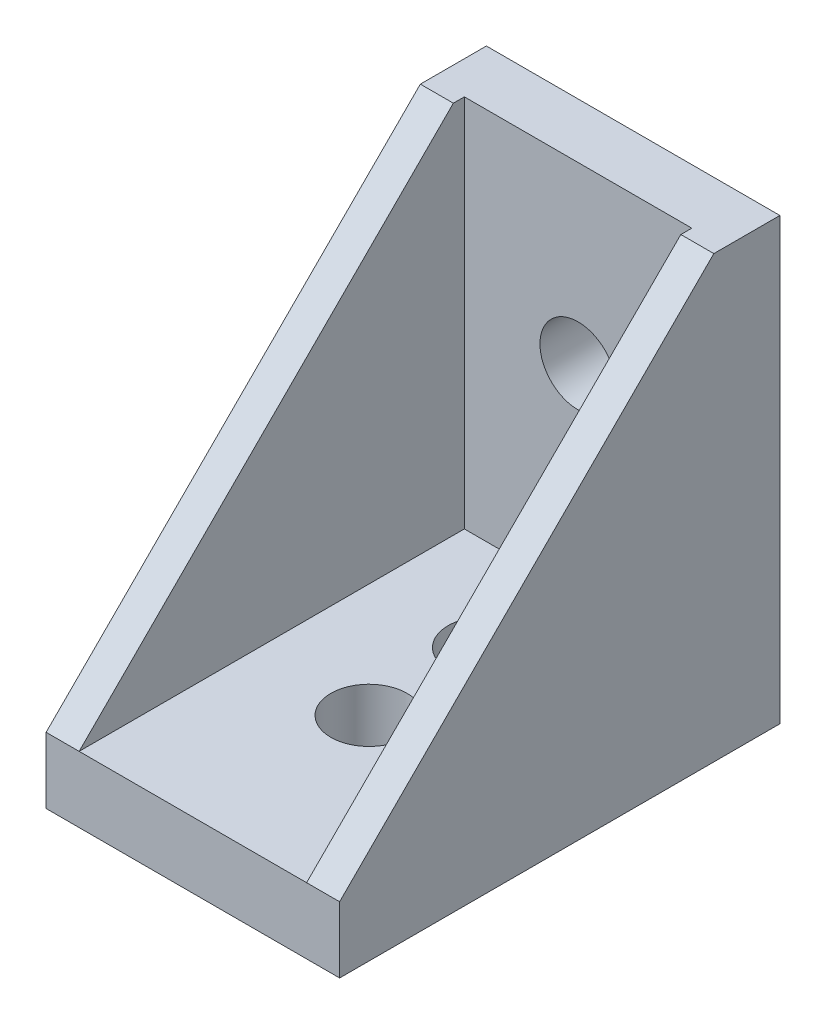
ISO-10303-21;
HEADER;
FILE_DESCRIPTION(('STEP AP214'),'2;1');
FILE_NAME('part.step','',(''),(''),'','','');
FILE_SCHEMA(('AUTOMOTIVE_DESIGN { 1 0 10303 214 1 1 1 1 }'));
ENDSEC;
DATA;
#1=APPLICATION_CONTEXT('core data for automotive mechanical design processes');
#2=APPLICATION_PROTOCOL_DEFINITION('international standard','automotive_design',2000,#1);
#3=PRODUCT_CONTEXT('',#1,'mechanical');
#4=PRODUCT('Part','Part','',(#3));
#5=PRODUCT_RELATED_PRODUCT_CATEGORY('part','',(#4));
#6=PRODUCT_DEFINITION_FORMATION('','',#4);
#7=PRODUCT_DEFINITION_CONTEXT('part definition',#1,'design');
#8=PRODUCT_DEFINITION('design','',#6,#7);
#9=PRODUCT_DEFINITION_SHAPE('','',#8);
#10=(LENGTH_UNIT() NAMED_UNIT(*) SI_UNIT(.MILLI.,.METRE.));
#11=(NAMED_UNIT(*) PLANE_ANGLE_UNIT() SI_UNIT($,.RADIAN.));
#12=(NAMED_UNIT(*) SI_UNIT($,.STERADIAN.) SOLID_ANGLE_UNIT());
#13=UNCERTAINTY_MEASURE_WITH_UNIT(LENGTH_MEASURE(1.E-05),#10,'distance_accuracy_value','');
#14=(GEOMETRIC_REPRESENTATION_CONTEXT(3) GLOBAL_UNCERTAINTY_ASSIGNED_CONTEXT((#13)) GLOBAL_UNIT_ASSIGNED_CONTEXT((#10,
#11,#12)) REPRESENTATION_CONTEXT('',''));
#15=CARTESIAN_POINT('',(0.,0.,0.));
#16=DIRECTION('',(0.,0.,1.));
#17=DIRECTION('',(1.,0.,0.));
#18=AXIS2_PLACEMENT_3D('',#15,#16,#17);
#19=CARTESIAN_POINT('',(7.75,0.,0.));
#20=DIRECTION('',(1.,0.,0.));
#21=DIRECTION('',(0.,0.,-1.));
#22=AXIS2_PLACEMENT_3D('',#19,#20,#21);
#23=PLANE('',#22);
#24=DIRECTION('',(0.,0.,-1.));
#25=VECTOR('',#24,1.);
#26=CARTESIAN_POINT('',(7.75,4.5,11.25));
#27=LINE('',#26,#25);
#28=CARTESIAN_POINT('',(7.75,4.5,-11.25));
#29=VERTEX_POINT('',#28);
#30=CARTESIAN_POINT('',(7.75,4.5,15.));
#31=VERTEX_POINT('',#30);
#32=EDGE_CURVE('E105',#29,#31,#27,.F.);
#33=ORIENTED_EDGE('',*,*,#32,.T.);
#34=DIRECTION('',(0.,0.707106781186548,-0.707106781186547));
#35=VECTOR('',#34,1.);
#36=CARTESIAN_POINT('',(7.75,4.5,15.));
#37=LINE('',#36,#35);
#38=CARTESIAN_POINT('',(7.75,30.,-10.5));
#39=VERTEX_POINT('',#38);
#40=EDGE_CURVE('E137',#31,#39,#37,.T.);
#41=ORIENTED_EDGE('',*,*,#40,.T.);
#42=DIRECTION('',(0.,0.,-1.));
#43=VECTOR('',#42,1.);
#44=CARTESIAN_POINT('',(7.75,30.,0.));
#45=LINE('',#44,#43);
#46=CARTESIAN_POINT('',(7.75,30.,-11.25));
#47=VERTEX_POINT('',#46);
#48=EDGE_CURVE('E152',#47,#39,#45,.F.);
#49=ORIENTED_EDGE('',*,*,#48,.F.);
#50=DIRECTION('',(0.,1.,0.));
#51=VECTOR('',#50,1.);
#52=CARTESIAN_POINT('',(7.75,4.5,-11.25));
#53=LINE('',#52,#51);
#54=EDGE_CURVE('E132',#47,#29,#53,.F.);
#55=ORIENTED_EDGE('',*,*,#54,.T.);
#56=EDGE_LOOP('',(#33,#41,#49,#55));
#57=FACE_BOUND('',#56,.T.);
#58=ADVANCED_FACE('F17',(#57),#23,.F.);
#59=CARTESIAN_POINT('',(-7.75,0.,0.));
#60=DIRECTION('',(1.,0.,0.));
#61=DIRECTION('',(0.,0.,-1.));
#62=AXIS2_PLACEMENT_3D('',#59,#60,#61);
#63=PLANE('',#62);
#64=DIRECTION('',(0.,0.707106781186548,-0.707106781186547));
#65=VECTOR('',#64,1.);
#66=CARTESIAN_POINT('',(-7.75,4.5,15.));
#67=LINE('',#66,#65);
#68=CARTESIAN_POINT('',(-7.75,30.,-10.5));
#69=VERTEX_POINT('',#68);
#70=CARTESIAN_POINT('',(-7.75,4.5,15.));
#71=VERTEX_POINT('',#70);
#72=EDGE_CURVE('E118',#69,#71,#67,.F.);
#73=ORIENTED_EDGE('',*,*,#72,.T.);
#74=DIRECTION('',(0.,0.,-1.));
#75=VECTOR('',#74,1.);
#76=CARTESIAN_POINT('',(-7.75,4.5,11.25));
#77=LINE('',#76,#75);
#78=CARTESIAN_POINT('',(-7.75,4.5,-11.25));
#79=VERTEX_POINT('',#78);
#80=EDGE_CURVE('E112',#71,#79,#77,.T.);
#81=ORIENTED_EDGE('',*,*,#80,.T.);
#82=DIRECTION('',(0.,1.,0.));
#83=VECTOR('',#82,1.);
#84=CARTESIAN_POINT('',(-7.75,4.5,-11.25));
#85=LINE('',#84,#83);
#86=CARTESIAN_POINT('',(-7.75,30.,-11.25));
#87=VERTEX_POINT('',#86);
#88=EDGE_CURVE('E115',#79,#87,#85,.T.);
#89=ORIENTED_EDGE('',*,*,#88,.T.);
#90=DIRECTION('',(0.,0.,-1.));
#91=VECTOR('',#90,1.);
#92=CARTESIAN_POINT('',(-7.75,30.,0.));
#93=LINE('',#92,#91);
#94=EDGE_CURVE('E121',#87,#69,#93,.F.);
#95=ORIENTED_EDGE('',*,*,#94,.T.);
#96=EDGE_LOOP('',(#73,#81,#89,#95));
#97=FACE_BOUND('',#96,.T.);
#98=ADVANCED_FACE('F114',(#97),#63,.T.);
#99=CARTESIAN_POINT('',(-7.75,4.5,11.25));
#100=DIRECTION('',(0.,-1.,0.));
#101=DIRECTION('',(0.,0.,-1.));
#102=AXIS2_PLACEMENT_3D('',#99,#100,#101);
#103=PLANE('',#102);
#104=DIRECTION('',(-1.,0.,0.));
#105=VECTOR('',#104,1.);
#106=CARTESIAN_POINT('',(-7.75,4.5,-11.25));
#107=LINE('',#106,#105);
#108=EDGE_CURVE('E127',#29,#79,#107,.T.);
#109=ORIENTED_EDGE('',*,*,#108,.T.);
#110=ORIENTED_EDGE('',*,*,#80,.F.);
#111=DIRECTION('',(1.,0.,0.));
#112=VECTOR('',#111,1.);
#113=CARTESIAN_POINT('',(10.,4.5,15.));
#114=LINE('',#113,#112);
#115=EDGE_CURVE('E247',#71,#31,#114,.T.);
#116=ORIENTED_EDGE('',*,*,#115,.T.);
#117=ORIENTED_EDGE('',*,*,#32,.F.);
#118=EDGE_LOOP('',(#109,#110,#116,#117));
#119=FACE_BOUND('',#118,.T.);
#120=CARTESIAN_POINT('',(0.,4.5,-5.));
#121=DIRECTION('',(0.,1.,0.));
#122=DIRECTION('',(0.,0.,1.));
#123=AXIS2_PLACEMENT_3D('',#120,#121,#122);
#124=CIRCLE('',#123,2.6);
#125=CARTESIAN_POINT('',(0.,4.5,-2.4));
#126=VERTEX_POINT('',#125);
#127=EDGE_CURVE('E144',#126,#126,#124,.F.);
#128=ORIENTED_EDGE('',*,*,#127,.T.);
#129=EDGE_LOOP('',(#128));
#130=FACE_BOUND('',#129,.T.);
#131=CARTESIAN_POINT('',(0.,4.5,3.00000000000001));
#132=DIRECTION('',(0.,1.,0.));
#133=DIRECTION('',(0.,0.,1.));
#134=AXIS2_PLACEMENT_3D('',#131,#132,#133);
#135=CIRCLE('',#134,2.6);
#136=CARTESIAN_POINT('',(0.,4.5,5.60000000000001));
#137=VERTEX_POINT('',#136);
#138=EDGE_CURVE('E20',#137,#137,#135,.F.);
#139=ORIENTED_EDGE('',*,*,#138,.T.);
#140=EDGE_LOOP('',(#139));
#141=FACE_BOUND('',#140,.T.);
#142=ADVANCED_FACE('F134',(#119,#130,#141),#103,.F.);
#143=CARTESIAN_POINT('',(0.,-11.,3.00000000000001));
#144=DIRECTION('',(0.,1.,0.));
#145=DIRECTION('',(0.,0.,1.));
#146=AXIS2_PLACEMENT_3D('',#143,#144,#145);
#147=CYLINDRICAL_SURFACE('',#146,2.6);
#148=CARTESIAN_POINT('',(0.,0.,3.00000000000001));
#149=DIRECTION('',(0.,1.,0.));
#150=DIRECTION('',(0.,0.,1.));
#151=AXIS2_PLACEMENT_3D('',#148,#149,#150);
#152=CIRCLE('',#151,2.6);
#153=CARTESIAN_POINT('',(0.,0.,5.60000000000001));
#154=VERTEX_POINT('',#153);
#155=EDGE_CURVE('E166',#154,#154,#152,.F.);
#156=ORIENTED_EDGE('',*,*,#155,.T.);
#157=EDGE_LOOP('',(#156));
#158=FACE_BOUND('',#157,.T.);
#159=ORIENTED_EDGE('',*,*,#138,.F.);
#160=EDGE_LOOP('',(#159));
#161=FACE_BOUND('',#160,.T.);
#162=ADVANCED_FACE('F183',(#158,#161),#147,.F.);
#163=CARTESIAN_POINT('',(0.,-11.,-5.));
#164=DIRECTION('',(0.,1.,0.));
#165=DIRECTION('',(0.,0.,1.));
#166=AXIS2_PLACEMENT_3D('',#163,#164,#165);
#167=CYLINDRICAL_SURFACE('',#166,2.6);
#168=CARTESIAN_POINT('',(0.,0.,-5.));
#169=DIRECTION('',(0.,1.,0.));
#170=DIRECTION('',(0.,0.,1.));
#171=AXIS2_PLACEMENT_3D('',#168,#169,#170);
#172=CIRCLE('',#171,2.6);
#173=CARTESIAN_POINT('',(0.,0.,-2.4));
#174=VERTEX_POINT('',#173);
#175=EDGE_CURVE('E161',#174,#174,#172,.F.);
#176=ORIENTED_EDGE('',*,*,#175,.T.);
#177=EDGE_LOOP('',(#176));
#178=FACE_BOUND('',#177,.T.);
#179=ORIENTED_EDGE('',*,*,#127,.F.);
#180=EDGE_LOOP('',(#179));
#181=FACE_BOUND('',#180,.T.);
#182=ADVANCED_FACE('F185',(#178,#181),#167,.F.);
#183=CARTESIAN_POINT('',(10.,4.5,15.));
#184=DIRECTION('',(0.,-0.707106781186547,-0.707106781186548));
#185=DIRECTION('',(0.,0.707106781186548,-0.707106781186547));
#186=AXIS2_PLACEMENT_3D('',#183,#184,#185);
#187=PLANE('',#186);
#188=ORIENTED_EDGE('',*,*,#40,.F.);
#189=DIRECTION('',(1.,0.,0.));
#190=VECTOR('',#189,1.);
#191=CARTESIAN_POINT('',(10.,4.5,15.));
#192=LINE('',#191,#190);
#193=CARTESIAN_POINT('',(10.,4.5,15.));
#194=VERTEX_POINT('',#193);
#195=EDGE_CURVE('E173',#31,#194,#192,.T.);
#196=ORIENTED_EDGE('',*,*,#195,.T.);
#197=DIRECTION('',(0.,-0.707106781186548,0.707106781186547));
#198=VECTOR('',#197,1.);
#199=CARTESIAN_POINT('',(10.,30.,-10.5));
#200=LINE('',#199,#198);
#201=CARTESIAN_POINT('',(10.,30.,-10.5));
#202=VERTEX_POINT('',#201);
#203=EDGE_CURVE('E266',#202,#194,#200,.T.);
#204=ORIENTED_EDGE('',*,*,#203,.F.);
#205=DIRECTION('',(1.,0.,0.));
#206=VECTOR('',#205,1.);
#207=CARTESIAN_POINT('',(10.,30.,-10.5));
#208=LINE('',#207,#206);
#209=EDGE_CURVE('E244',#202,#39,#208,.F.);
#210=ORIENTED_EDGE('',*,*,#209,.T.);
#211=EDGE_LOOP('',(#188,#196,#204,#210));
#212=FACE_BOUND('',#211,.T.);
#213=ADVANCED_FACE('F193',(#212),#187,.F.);
#214=CARTESIAN_POINT('',(-7.75,4.5,-11.25));
#215=DIRECTION('',(0.,0.,-1.));
#216=DIRECTION('',(-1.,0.,0.));
#217=AXIS2_PLACEMENT_3D('',#214,#215,#216);
#218=PLANE('',#217);
#219=DIRECTION('',(1.,0.,0.));
#220=VECTOR('',#219,1.);
#221=CARTESIAN_POINT('',(10.,30.,-11.25));
#222=LINE('',#221,#220);
#223=EDGE_CURVE('E130',#47,#87,#222,.F.);
#224=ORIENTED_EDGE('',*,*,#223,.T.);
#225=ORIENTED_EDGE('',*,*,#88,.F.);
#226=ORIENTED_EDGE('',*,*,#108,.F.);
#227=ORIENTED_EDGE('',*,*,#54,.F.);
#228=EDGE_LOOP('',(#224,#225,#226,#227));
#229=FACE_BOUND('',#228,.T.);
#230=CARTESIAN_POINT('',(0.,18.,-11.25));
#231=DIRECTION('',(0.,0.,1.));
#232=DIRECTION('',(1.,0.,0.));
#233=AXIS2_PLACEMENT_3D('',#230,#231,#232);
#234=CIRCLE('',#233,2.6);
#235=CARTESIAN_POINT('',(2.60000000000001,18.,-11.25));
#236=VERTEX_POINT('',#235);
#237=EDGE_CURVE('E170',#236,#236,#234,.F.);
#238=ORIENTED_EDGE('',*,*,#237,.T.);
#239=EDGE_LOOP('',(#238));
#240=FACE_BOUND('',#239,.T.);
#241=ADVANCED_FACE('F124',(#229,#240),#218,.F.);
#242=CARTESIAN_POINT('',(10.,4.5,15.));
#243=DIRECTION('',(0.,-0.707106781186547,-0.707106781186548));
#244=DIRECTION('',(0.,0.707106781186548,-0.707106781186547));
#245=AXIS2_PLACEMENT_3D('',#242,#243,#244);
#246=PLANE('',#245);
#247=DIRECTION('',(1.,0.,0.));
#248=VECTOR('',#247,1.);
#249=CARTESIAN_POINT('',(10.,30.,-10.5));
#250=LINE('',#249,#248);
#251=CARTESIAN_POINT('',(-10.,30.,-10.5));
#252=VERTEX_POINT('',#251);
#253=EDGE_CURVE('E278',#69,#252,#250,.F.);
#254=ORIENTED_EDGE('',*,*,#253,.T.);
#255=DIRECTION('',(0.,-0.707106781186548,0.707106781186547));
#256=VECTOR('',#255,1.);
#257=CARTESIAN_POINT('',(-10.,30.,-10.5));
#258=LINE('',#257,#256);
#259=CARTESIAN_POINT('',(-10.,4.5,15.));
#260=VERTEX_POINT('',#259);
#261=EDGE_CURVE('E288',#252,#260,#258,.T.);
#262=ORIENTED_EDGE('',*,*,#261,.T.);
#263=DIRECTION('',(1.,0.,0.));
#264=VECTOR('',#263,1.);
#265=CARTESIAN_POINT('',(10.,4.5,15.));
#266=LINE('',#265,#264);
#267=EDGE_CURVE('E253',#260,#71,#266,.T.);
#268=ORIENTED_EDGE('',*,*,#267,.T.);
#269=ORIENTED_EDGE('',*,*,#72,.F.);
#270=EDGE_LOOP('',(#254,#262,#268,#269));
#271=FACE_BOUND('',#270,.T.);
#272=ADVANCED_FACE('F228',(#271),#246,.F.);
#273=CARTESIAN_POINT('',(10.,0.,15.));
#274=DIRECTION('',(0.,0.,-1.));
#275=DIRECTION('',(0.,1.,0.));
#276=AXIS2_PLACEMENT_3D('',#273,#274,#275);
#277=PLANE('',#276);
#278=DIRECTION('',(1.,0.,0.));
#279=VECTOR('',#278,1.);
#280=CARTESIAN_POINT('',(10.,0.,15.));
#281=LINE('',#280,#279);
#282=CARTESIAN_POINT('',(-10.,0.,15.));
#283=VERTEX_POINT('',#282);
#284=CARTESIAN_POINT('',(10.,0.,15.));
#285=VERTEX_POINT('',#284);
#286=EDGE_CURVE('E165',#283,#285,#281,.T.);
#287=ORIENTED_EDGE('',*,*,#286,.T.);
#288=DIRECTION('',(0.,1.,0.));
#289=VECTOR('',#288,1.);
#290=CARTESIAN_POINT('',(10.,0.,15.));
#291=LINE('',#290,#289);
#292=EDGE_CURVE('E249',#194,#285,#291,.F.);
#293=ORIENTED_EDGE('',*,*,#292,.F.);
#294=ORIENTED_EDGE('',*,*,#195,.F.);
#295=ORIENTED_EDGE('',*,*,#115,.F.);
#296=ORIENTED_EDGE('',*,*,#267,.F.);
#297=DIRECTION('',(0.,1.,0.));
#298=VECTOR('',#297,1.);
#299=CARTESIAN_POINT('',(-10.,0.,15.));
#300=LINE('',#299,#298);
#301=EDGE_CURVE('E292',#260,#283,#300,.F.);
#302=ORIENTED_EDGE('',*,*,#301,.T.);
#303=EDGE_LOOP('',(#287,#293,#294,#295,#296,#302));
#304=FACE_BOUND('',#303,.T.);
#305=ADVANCED_FACE('F224',(#304),#277,.F.);
#306=CARTESIAN_POINT('',(0.,18.,-26.75));
#307=DIRECTION('',(0.,0.,1.));
#308=DIRECTION('',(1.,0.,0.));
#309=AXIS2_PLACEMENT_3D('',#306,#307,#308);
#310=CYLINDRICAL_SURFACE('',#309,2.6);
#311=CARTESIAN_POINT('',(0.,18.,-15.));
#312=DIRECTION('',(0.,0.,1.));
#313=DIRECTION('',(1.,0.,0.));
#314=AXIS2_PLACEMENT_3D('',#311,#312,#313);
#315=CIRCLE('',#314,2.6);
#316=CARTESIAN_POINT('',(2.60000000000001,18.,-15.));
#317=VERTEX_POINT('',#316);
#318=EDGE_CURVE('E155',#317,#317,#315,.F.);
#319=ORIENTED_EDGE('',*,*,#318,.T.);
#320=EDGE_LOOP('',(#319));
#321=FACE_BOUND('',#320,.T.);
#322=ORIENTED_EDGE('',*,*,#237,.F.);
#323=EDGE_LOOP('',(#322));
#324=FACE_BOUND('',#323,.T.);
#325=ADVANCED_FACE('F220',(#321,#324),#310,.F.);
#326=CARTESIAN_POINT('',(10.,0.,15.));
#327=DIRECTION('',(0.,1.,0.));
#328=DIRECTION('',(0.,0.,1.));
#329=AXIS2_PLACEMENT_3D('',#326,#327,#328);
#330=PLANE('',#329);
#331=DIRECTION('',(1.,0.,0.));
#332=VECTOR('',#331,1.);
#333=CARTESIAN_POINT('',(10.,0.,-15.));
#334=LINE('',#333,#332);
#335=CARTESIAN_POINT('',(-10.,0.,-15.));
#336=VERTEX_POINT('',#335);
#337=CARTESIAN_POINT('',(10.,0.,-15.));
#338=VERTEX_POINT('',#337);
#339=EDGE_CURVE('E159',#336,#338,#334,.T.);
#340=ORIENTED_EDGE('',*,*,#339,.T.);
#341=DIRECTION('',(0.,0.,-1.));
#342=VECTOR('',#341,1.);
#343=CARTESIAN_POINT('',(10.,0.,0.));
#344=LINE('',#343,#342);
#345=EDGE_CURVE('E285',#285,#338,#344,.T.);
#346=ORIENTED_EDGE('',*,*,#345,.F.);
#347=ORIENTED_EDGE('',*,*,#286,.F.);
#348=DIRECTION('',(0.,0.,-1.));
#349=VECTOR('',#348,1.);
#350=CARTESIAN_POINT('',(-10.,0.,0.));
#351=LINE('',#350,#349);
#352=EDGE_CURVE('E160',#283,#336,#351,.T.);
#353=ORIENTED_EDGE('',*,*,#352,.T.);
#354=EDGE_LOOP('',(#340,#346,#347,#353));
#355=FACE_BOUND('',#354,.T.);
#356=ORIENTED_EDGE('',*,*,#175,.F.);
#357=EDGE_LOOP('',(#356));
#358=FACE_BOUND('',#357,.T.);
#359=ORIENTED_EDGE('',*,*,#155,.F.);
#360=EDGE_LOOP('',(#359));
#361=FACE_BOUND('',#360,.T.);
#362=ADVANCED_FACE('F216',(#355,#358,#361),#330,.F.);
#363=CARTESIAN_POINT('',(10.,0.,0.));
#364=DIRECTION('',(1.,0.,0.));
#365=DIRECTION('',(0.,0.,-1.));
#366=AXIS2_PLACEMENT_3D('',#363,#364,#365);
#367=PLANE('',#366);
#368=ORIENTED_EDGE('',*,*,#292,.T.);
#369=ORIENTED_EDGE('',*,*,#345,.T.);
#370=DIRECTION('',(0.,-1.,0.));
#371=VECTOR('',#370,1.);
#372=CARTESIAN_POINT('',(10.,0.,-15.));
#373=LINE('',#372,#371);
#374=CARTESIAN_POINT('',(10.,30.,-15.));
#375=VERTEX_POINT('',#374);
#376=EDGE_CURVE('E269',#338,#375,#373,.F.);
#377=ORIENTED_EDGE('',*,*,#376,.T.);
#378=DIRECTION('',(0.,0.,-1.));
#379=VECTOR('',#378,1.);
#380=CARTESIAN_POINT('',(10.,30.,-15.));
#381=LINE('',#380,#379);
#382=EDGE_CURVE('E275',#375,#202,#381,.F.);
#383=ORIENTED_EDGE('',*,*,#382,.T.);
#384=ORIENTED_EDGE('',*,*,#203,.T.);
#385=EDGE_LOOP('',(#368,#369,#377,#383,#384));
#386=FACE_BOUND('',#385,.T.);
#387=ADVANCED_FACE('F212',(#386),#367,.T.);
#388=CARTESIAN_POINT('',(10.,30.,-15.));
#389=DIRECTION('',(0.,-1.,0.));
#390=DIRECTION('',(0.,0.,-1.));
#391=AXIS2_PLACEMENT_3D('',#388,#389,#390);
#392=PLANE('',#391);
#393=ORIENTED_EDGE('',*,*,#223,.F.);
#394=ORIENTED_EDGE('',*,*,#48,.T.);
#395=ORIENTED_EDGE('',*,*,#209,.F.);
#396=ORIENTED_EDGE('',*,*,#382,.F.);
#397=DIRECTION('',(1.,0.,0.));
#398=VECTOR('',#397,1.);
#399=CARTESIAN_POINT('',(10.,30.,-15.));
#400=LINE('',#399,#398);
#401=CARTESIAN_POINT('',(-10.,30.,-15.));
#402=VERTEX_POINT('',#401);
#403=EDGE_CURVE('E27',#375,#402,#400,.F.);
#404=ORIENTED_EDGE('',*,*,#403,.T.);
#405=DIRECTION('',(0.,0.,-1.));
#406=VECTOR('',#405,1.);
#407=CARTESIAN_POINT('',(-10.,30.,0.));
#408=LINE('',#407,#406);
#409=EDGE_CURVE('E38',#402,#252,#408,.F.);
#410=ORIENTED_EDGE('',*,*,#409,.T.);
#411=ORIENTED_EDGE('',*,*,#253,.F.);
#412=ORIENTED_EDGE('',*,*,#94,.F.);
#413=EDGE_LOOP('',(#393,#394,#395,#396,#404,#410,#411,#412));
#414=FACE_BOUND('',#413,.T.);
#415=ADVANCED_FACE('F205',(#414),#392,.F.);
#416=CARTESIAN_POINT('',(-10.,0.,0.));
#417=DIRECTION('',(1.,0.,0.));
#418=DIRECTION('',(0.,0.,-1.));
#419=AXIS2_PLACEMENT_3D('',#416,#417,#418);
#420=PLANE('',#419);
#421=ORIENTED_EDGE('',*,*,#352,.F.);
#422=ORIENTED_EDGE('',*,*,#301,.F.);
#423=ORIENTED_EDGE('',*,*,#261,.F.);
#424=ORIENTED_EDGE('',*,*,#409,.F.);
#425=DIRECTION('',(0.,-1.,0.));
#426=VECTOR('',#425,1.);
#427=CARTESIAN_POINT('',(-10.,0.,-15.));
#428=LINE('',#427,#426);
#429=EDGE_CURVE('E11',#402,#336,#428,.T.);
#430=ORIENTED_EDGE('',*,*,#429,.T.);
#431=EDGE_LOOP('',(#421,#422,#423,#424,#430));
#432=FACE_BOUND('',#431,.T.);
#433=ADVANCED_FACE('F199',(#432),#420,.F.);
#434=CARTESIAN_POINT('',(10.,0.,-15.));
#435=DIRECTION('',(0.,0.,1.));
#436=DIRECTION('',(0.,-1.,0.));
#437=AXIS2_PLACEMENT_3D('',#434,#435,#436);
#438=PLANE('',#437);
#439=ORIENTED_EDGE('',*,*,#403,.F.);
#440=ORIENTED_EDGE('',*,*,#376,.F.);
#441=ORIENTED_EDGE('',*,*,#339,.F.);
#442=ORIENTED_EDGE('',*,*,#429,.F.);
#443=EDGE_LOOP('',(#439,#440,#441,#442));
#444=FACE_BOUND('',#443,.T.);
#445=ORIENTED_EDGE('',*,*,#318,.F.);
#446=EDGE_LOOP('',(#445));
#447=FACE_BOUND('',#446,.T.);
#448=ADVANCED_FACE('F197',(#444,#447),#438,.F.);
#449=CLOSED_SHELL('',(#58,#98,#142,#162,#182,#213,#241,#272,#305,#325,#362,#387,#415,#433,#448));
#450=MANIFOLD_SOLID_BREP('B1',#449);
#451=ADVANCED_BREP_SHAPE_REPRESENTATION('',(#18,#450),#14);
#452=SHAPE_DEFINITION_REPRESENTATION(#9,#451);
ENDSEC;
END-ISO-10303-21;
